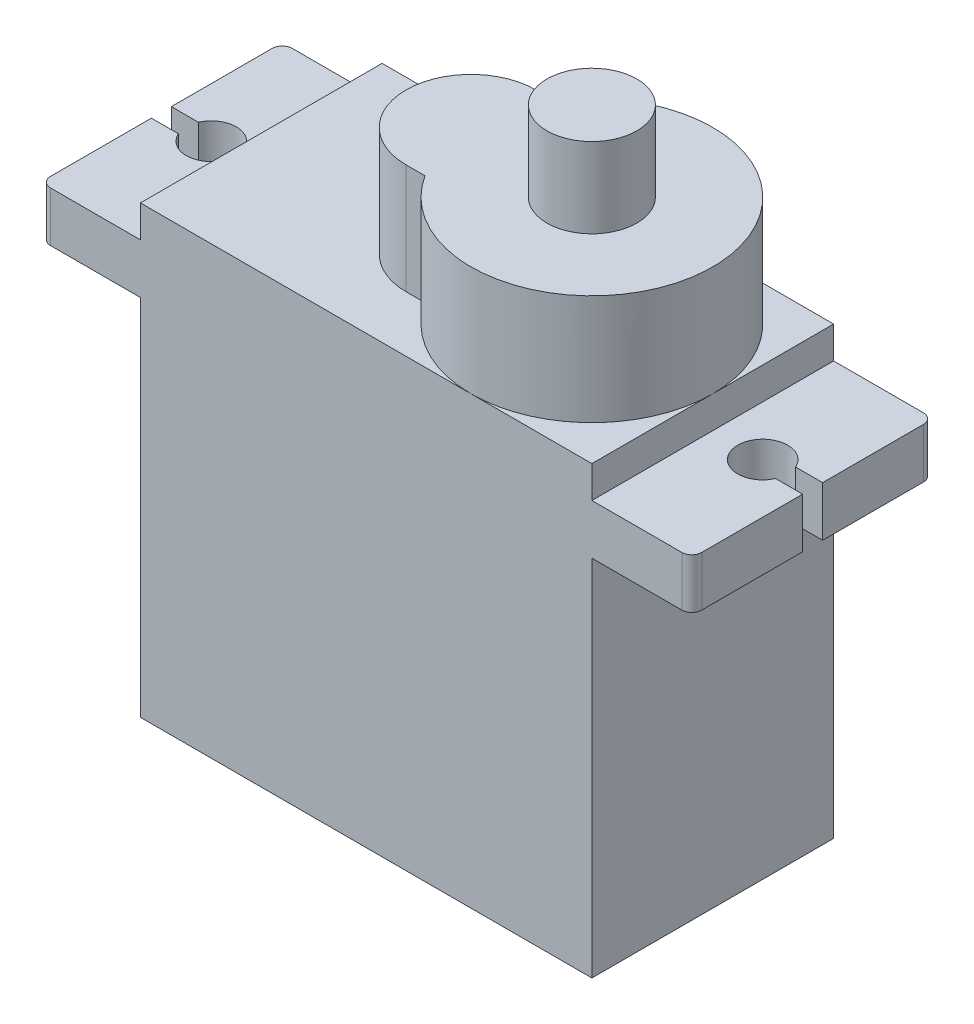
ISO-10303-21;
HEADER;
FILE_DESCRIPTION(('STEP AP214'),'2;1');
FILE_NAME('part.step','',(''),(''),'','','');
FILE_SCHEMA(('AUTOMOTIVE_DESIGN { 1 0 10303 214 1 1 1 1 }'));
ENDSEC;
DATA;
#1=APPLICATION_CONTEXT('core data for automotive mechanical design processes');
#2=APPLICATION_PROTOCOL_DEFINITION('international standard','automotive_design',2000,#1);
#3=PRODUCT_CONTEXT('',#1,'mechanical');
#4=PRODUCT('Part','Part','',(#3));
#5=PRODUCT_RELATED_PRODUCT_CATEGORY('part','',(#4));
#6=PRODUCT_DEFINITION_FORMATION('','',#4);
#7=PRODUCT_DEFINITION_CONTEXT('part definition',#1,'design');
#8=PRODUCT_DEFINITION('design','',#6,#7);
#9=PRODUCT_DEFINITION_SHAPE('','',#8);
#10=(LENGTH_UNIT() NAMED_UNIT(*) SI_UNIT(.MILLI.,.METRE.));
#11=(NAMED_UNIT(*) PLANE_ANGLE_UNIT() SI_UNIT($,.RADIAN.));
#12=(NAMED_UNIT(*) SI_UNIT($,.STERADIAN.) SOLID_ANGLE_UNIT());
#13=UNCERTAINTY_MEASURE_WITH_UNIT(LENGTH_MEASURE(1.E-05),#10,'distance_accuracy_value','');
#14=(GEOMETRIC_REPRESENTATION_CONTEXT(3) GLOBAL_UNCERTAINTY_ASSIGNED_CONTEXT((#13)) GLOBAL_UNIT_ASSIGNED_CONTEXT((#10,
#11,#12)) REPRESENTATION_CONTEXT('',''));
#15=CARTESIAN_POINT('',(0.,0.,0.));
#16=DIRECTION('',(0.,0.,1.));
#17=DIRECTION('',(1.,0.,0.));
#18=AXIS2_PLACEMENT_3D('',#15,#16,#17);
#19=CARTESIAN_POINT('',(-16.3,18.2,6.05));
#20=DIRECTION('',(0.,-1.,0.));
#21=DIRECTION('',(0.,0.,-1.));
#22=AXIS2_PLACEMENT_3D('',#19,#20,#21);
#23=PLANE('',#22);
#24=DIRECTION('',(1.,0.,0.));
#25=VECTOR('',#24,1.);
#26=CARTESIAN_POINT('',(-16.3,18.2,6.05));
#27=LINE('',#26,#25);
#28=CARTESIAN_POINT('',(-15.8,18.2,6.05));
#29=VERTEX_POINT('',#28);
#30=CARTESIAN_POINT('',(-11.3,18.2,6.05));
#31=VERTEX_POINT('',#30);
#32=EDGE_CURVE('E304',#29,#31,#27,.T.);
#33=ORIENTED_EDGE('',*,*,#32,.F.);
#34=CARTESIAN_POINT('',(-15.8,18.2,5.55));
#35=DIRECTION('',(0.,-1.,0.));
#36=DIRECTION('',(0.,0.,-1.));
#37=AXIS2_PLACEMENT_3D('',#34,#35,#36);
#38=CIRCLE('',#37,0.5);
#39=CARTESIAN_POINT('',(-16.3,18.2,5.55));
#40=VERTEX_POINT('',#39);
#41=EDGE_CURVE('E404',#29,#40,#38,.T.);
#42=ORIENTED_EDGE('',*,*,#41,.T.);
#43=DIRECTION('',(0.,0.,-1.));
#44=VECTOR('',#43,1.);
#45=CARTESIAN_POINT('',(-16.3,18.2,6.05));
#46=LINE('',#45,#44);
#47=CARTESIAN_POINT('',(-16.3,18.2,0.5));
#48=VERTEX_POINT('',#47);
#49=EDGE_CURVE('E279',#40,#48,#46,.T.);
#50=ORIENTED_EDGE('',*,*,#49,.T.);
#51=DIRECTION('',(1.,0.,0.));
#52=VECTOR('',#51,1.);
#53=CARTESIAN_POINT('',(0.,18.2,0.500000000000003));
#54=LINE('',#53,#52);
#55=CARTESIAN_POINT('',(-14.945643923739,18.2,0.5));
#56=VERTEX_POINT('',#55);
#57=EDGE_CURVE('E959',#48,#56,#54,.T.);
#58=ORIENTED_EDGE('',*,*,#57,.T.);
#59=CARTESIAN_POINT('',(-13.8,18.2,0.));
#60=DIRECTION('',(0.,-1.,0.));
#61=DIRECTION('',(0.,0.,-1.));
#62=AXIS2_PLACEMENT_3D('',#59,#60,#61);
#63=CIRCLE('',#62,1.25);
#64=CARTESIAN_POINT('',(-14.945643923739,18.2,-0.499999999999999));
#65=VERTEX_POINT('',#64);
#66=EDGE_CURVE('E272',#65,#56,#63,.T.);
#67=ORIENTED_EDGE('',*,*,#66,.F.);
#68=DIRECTION('',(1.,0.,0.));
#69=VECTOR('',#68,1.);
#70=CARTESIAN_POINT('',(0.,18.2,-0.49999999999999));
#71=LINE('',#70,#69);
#72=CARTESIAN_POINT('',(-16.3,18.2,-0.5));
#73=VERTEX_POINT('',#72);
#74=EDGE_CURVE('E254',#73,#65,#71,.T.);
#75=ORIENTED_EDGE('',*,*,#74,.F.);
#76=CARTESIAN_POINT('',(-16.3,18.2,-5.55));
#77=VERTEX_POINT('',#76);
#78=EDGE_CURVE('E268',#73,#77,#46,.T.);
#79=ORIENTED_EDGE('',*,*,#78,.T.);
#80=CARTESIAN_POINT('',(-15.8,18.2,-5.55));
#81=DIRECTION('',(0.,-1.,0.));
#82=DIRECTION('',(0.,0.,-1.));
#83=AXIS2_PLACEMENT_3D('',#80,#81,#82);
#84=CIRCLE('',#83,0.5);
#85=CARTESIAN_POINT('',(-15.8,18.2,-6.05));
#86=VERTEX_POINT('',#85);
#87=EDGE_CURVE('E401',#77,#86,#84,.T.);
#88=ORIENTED_EDGE('',*,*,#87,.T.);
#89=DIRECTION('',(1.,0.,0.));
#90=VECTOR('',#89,1.);
#91=CARTESIAN_POINT('',(-16.3,18.2,-6.05));
#92=LINE('',#91,#90);
#93=CARTESIAN_POINT('',(-11.3,18.2,-6.05));
#94=VERTEX_POINT('',#93);
#95=EDGE_CURVE('E307',#86,#94,#92,.T.);
#96=ORIENTED_EDGE('',*,*,#95,.T.);
#97=DIRECTION('',(0.,0.,-1.));
#98=VECTOR('',#97,1.);
#99=CARTESIAN_POINT('',(-11.3,18.2,6.05));
#100=LINE('',#99,#98);
#101=EDGE_CURVE('E286',#31,#94,#100,.T.);
#102=ORIENTED_EDGE('',*,*,#101,.F.);
#103=EDGE_LOOP('',(#33,#42,#50,#58,#67,#75,#79,#88,#96,#102));
#104=FACE_BOUND('',#103,.T.);
#105=ADVANCED_FACE('F53',(#104),#23,.T.);
#106=CARTESIAN_POINT('',(-16.3,20.7,6.05));
#107=DIRECTION('',(0.,1.,0.));
#108=DIRECTION('',(0.,0.,1.));
#109=AXIS2_PLACEMENT_3D('',#106,#107,#108);
#110=PLANE('',#109);
#111=DIRECTION('',(0.,0.,1.));
#112=VECTOR('',#111,1.);
#113=CARTESIAN_POINT('',(-16.3,20.7,6.05));
#114=LINE('',#113,#112);
#115=CARTESIAN_POINT('',(-16.3,20.7,0.5));
#116=VERTEX_POINT('',#115);
#117=CARTESIAN_POINT('',(-16.3,20.7,5.55));
#118=VERTEX_POINT('',#117);
#119=EDGE_CURVE('E284',#116,#118,#114,.T.);
#120=ORIENTED_EDGE('',*,*,#119,.T.);
#121=CARTESIAN_POINT('',(-15.8,20.7,5.55));
#122=DIRECTION('',(0.,1.,0.));
#123=DIRECTION('',(0.,0.,1.));
#124=AXIS2_PLACEMENT_3D('',#121,#122,#123);
#125=CIRCLE('',#124,0.5);
#126=CARTESIAN_POINT('',(-15.8,20.7,6.05));
#127=VERTEX_POINT('',#126);
#128=EDGE_CURVE('E413',#118,#127,#125,.T.);
#129=ORIENTED_EDGE('',*,*,#128,.T.);
#130=DIRECTION('',(1.,0.,0.));
#131=VECTOR('',#130,1.);
#132=CARTESIAN_POINT('',(-16.3,20.7,6.05));
#133=LINE('',#132,#131);
#134=CARTESIAN_POINT('',(-11.3,20.7,6.05));
#135=VERTEX_POINT('',#134);
#136=EDGE_CURVE('E301',#127,#135,#133,.T.);
#137=ORIENTED_EDGE('',*,*,#136,.T.);
#138=DIRECTION('',(0.,0.,1.));
#139=VECTOR('',#138,1.);
#140=CARTESIAN_POINT('',(-11.3,20.7,6.05));
#141=LINE('',#140,#139);
#142=CARTESIAN_POINT('',(-11.3,20.7,-6.05));
#143=VERTEX_POINT('',#142);
#144=EDGE_CURVE('E280',#143,#135,#141,.T.);
#145=ORIENTED_EDGE('',*,*,#144,.F.);
#146=DIRECTION('',(1.,0.,0.));
#147=VECTOR('',#146,1.);
#148=CARTESIAN_POINT('',(-16.3,20.7,-6.05));
#149=LINE('',#148,#147);
#150=CARTESIAN_POINT('',(-15.8,20.7,-6.05));
#151=VERTEX_POINT('',#150);
#152=EDGE_CURVE('E295',#151,#143,#149,.T.);
#153=ORIENTED_EDGE('',*,*,#152,.F.);
#154=CARTESIAN_POINT('',(-15.8,20.7,-5.55));
#155=DIRECTION('',(0.,1.,0.));
#156=DIRECTION('',(0.,0.,1.));
#157=AXIS2_PLACEMENT_3D('',#154,#155,#156);
#158=CIRCLE('',#157,0.5);
#159=CARTESIAN_POINT('',(-16.3,20.7,-5.55));
#160=VERTEX_POINT('',#159);
#161=EDGE_CURVE('E410',#151,#160,#158,.T.);
#162=ORIENTED_EDGE('',*,*,#161,.T.);
#163=CARTESIAN_POINT('',(-16.3,20.7,-0.5));
#164=VERTEX_POINT('',#163);
#165=EDGE_CURVE('E292',#160,#164,#114,.T.);
#166=ORIENTED_EDGE('',*,*,#165,.T.);
#167=DIRECTION('',(1.,0.,0.));
#168=VECTOR('',#167,1.);
#169=CARTESIAN_POINT('',(0.,20.7,-0.49999999999999));
#170=LINE('',#169,#168);
#171=CARTESIAN_POINT('',(-14.945643923739,20.7,-0.499999999999999));
#172=VERTEX_POINT('',#171);
#173=EDGE_CURVE('E257',#164,#172,#170,.T.);
#174=ORIENTED_EDGE('',*,*,#173,.T.);
#175=CARTESIAN_POINT('',(-13.8,20.7,0.));
#176=DIRECTION('',(0.,-1.,0.));
#177=DIRECTION('',(0.,0.,1.));
#178=AXIS2_PLACEMENT_3D('',#175,#176,#177);
#179=CIRCLE('',#178,1.25);
#180=CARTESIAN_POINT('',(-14.945643923739,20.7,0.5));
#181=VERTEX_POINT('',#180);
#182=EDGE_CURVE('E263',#172,#181,#179,.T.);
#183=ORIENTED_EDGE('',*,*,#182,.T.);
#184=DIRECTION('',(1.,0.,0.));
#185=VECTOR('',#184,1.);
#186=CARTESIAN_POINT('',(0.,20.7,0.500000000000003));
#187=LINE('',#186,#185);
#188=EDGE_CURVE('E613',#116,#181,#187,.T.);
#189=ORIENTED_EDGE('',*,*,#188,.F.);
#190=EDGE_LOOP('',(#120,#129,#137,#145,#153,#162,#166,#174,#183,#189));
#191=FACE_BOUND('',#190,.T.);
#192=ADVANCED_FACE('F610',(#191),#110,.T.);
#193=CARTESIAN_POINT('',(-16.3,0.,0.));
#194=DIRECTION('',(-1.,0.,0.));
#195=DIRECTION('',(0.,0.,-1.));
#196=AXIS2_PLACEMENT_3D('',#193,#194,#195);
#197=PLANE('',#196);
#198=ORIENTED_EDGE('',*,*,#165,.F.);
#199=DIRECTION('',(0.,1.,0.));
#200=VECTOR('',#199,1.);
#201=CARTESIAN_POINT('',(-16.3,18.2,-5.55));
#202=LINE('',#201,#200);
#203=EDGE_CURVE('E277',#160,#77,#202,.F.);
#204=ORIENTED_EDGE('',*,*,#203,.T.);
#205=ORIENTED_EDGE('',*,*,#78,.F.);
#206=DIRECTION('',(0.,1.,0.));
#207=VECTOR('',#206,1.);
#208=CARTESIAN_POINT('',(-16.3,-0.001000000000001,-0.5));
#209=LINE('',#208,#207);
#210=EDGE_CURVE('E251',#73,#164,#209,.T.);
#211=ORIENTED_EDGE('',*,*,#210,.T.);
#212=EDGE_LOOP('',(#198,#204,#205,#211));
#213=FACE_BOUND('',#212,.T.);
#214=ADVANCED_FACE('F275',(#213),#197,.T.);
#215=CARTESIAN_POINT('',(16.3,0.,0.));
#216=DIRECTION('',(1.,0.,0.));
#217=DIRECTION('',(0.,0.,-1.));
#218=AXIS2_PLACEMENT_3D('',#215,#216,#217);
#219=PLANE('',#218);
#220=DIRECTION('',(0.,0.,1.));
#221=VECTOR('',#220,1.);
#222=CARTESIAN_POINT('',(16.3,20.7,6.05));
#223=LINE('',#222,#221);
#224=CARTESIAN_POINT('',(16.3,20.7,0.5));
#225=VERTEX_POINT('',#224);
#226=CARTESIAN_POINT('',(16.3,20.7,5.55));
#227=VERTEX_POINT('',#226);
#228=EDGE_CURVE('E315',#225,#227,#223,.T.);
#229=ORIENTED_EDGE('',*,*,#228,.T.);
#230=DIRECTION('',(0.,-1.,0.));
#231=VECTOR('',#230,1.);
#232=CARTESIAN_POINT('',(16.3,18.2,5.55));
#233=LINE('',#232,#231);
#234=CARTESIAN_POINT('',(16.3,18.2,5.55));
#235=VERTEX_POINT('',#234);
#236=EDGE_CURVE('E11',#227,#235,#233,.T.);
#237=ORIENTED_EDGE('',*,*,#236,.T.);
#238=DIRECTION('',(0.,0.,-1.));
#239=VECTOR('',#238,1.);
#240=CARTESIAN_POINT('',(16.3,18.2,6.05));
#241=LINE('',#240,#239);
#242=CARTESIAN_POINT('',(16.3,18.2,0.5));
#243=VERTEX_POINT('',#242);
#244=EDGE_CURVE('E316',#235,#243,#241,.T.);
#245=ORIENTED_EDGE('',*,*,#244,.T.);
#246=DIRECTION('',(0.,1.,0.));
#247=VECTOR('',#246,1.);
#248=CARTESIAN_POINT('',(16.3,-0.001000000000001,0.5));
#249=LINE('',#248,#247);
#250=EDGE_CURVE('E509',#243,#225,#249,.T.);
#251=ORIENTED_EDGE('',*,*,#250,.T.);
#252=EDGE_LOOP('',(#229,#237,#245,#251));
#253=FACE_BOUND('',#252,.T.);
#254=ADVANCED_FACE('F472',(#253),#219,.T.);
#255=CARTESIAN_POINT('',(0.,22.3,0.));
#256=DIRECTION('',(0.,-1.,0.));
#257=DIRECTION('',(0.,0.,-1.));
#258=AXIS2_PLACEMENT_3D('',#255,#256,#257);
#259=PLANE('',#258);
#260=CARTESIAN_POINT('',(5.25,22.3,0.));
#261=DIRECTION('',(0.,1.,0.));
#262=DIRECTION('',(0.,0.,1.));
#263=AXIS2_PLACEMENT_3D('',#260,#261,#262);
#264=CIRCLE('',#263,6.05);
#265=CARTESIAN_POINT('',(0.147059671130777,22.3,3.25));
#266=VERTEX_POINT('',#265);
#267=CARTESIAN_POINT('',(5.25,22.3,6.05));
#268=VERTEX_POINT('',#267);
#269=EDGE_CURVE('E523',#266,#268,#264,.T.);
#270=ORIENTED_EDGE('',*,*,#269,.F.);
#271=DIRECTION('',(1.,0.,0.));
#272=VECTOR('',#271,1.);
#273=CARTESIAN_POINT('',(0.,22.3,3.25));
#274=LINE('',#273,#272);
#275=CARTESIAN_POINT('',(-0.799999999999995,22.3,3.25));
#276=VERTEX_POINT('',#275);
#277=EDGE_CURVE('E532',#276,#266,#274,.T.);
#278=ORIENTED_EDGE('',*,*,#277,.F.);
#279=CARTESIAN_POINT('',(-0.799999999999995,22.3,0.));
#280=DIRECTION('',(0.,1.,0.));
#281=DIRECTION('',(0.,0.,1.));
#282=AXIS2_PLACEMENT_3D('',#279,#280,#281);
#283=CIRCLE('',#282,3.25);
#284=CARTESIAN_POINT('',(-0.799999999999996,22.3,-3.25));
#285=VERTEX_POINT('',#284);
#286=EDGE_CURVE('E550',#276,#285,#283,.F.);
#287=ORIENTED_EDGE('',*,*,#286,.T.);
#288=DIRECTION('',(1.,0.,0.));
#289=VECTOR('',#288,1.);
#290=CARTESIAN_POINT('',(0.,22.3,-3.25));
#291=LINE('',#290,#289);
#292=CARTESIAN_POINT('',(0.147059671130776,22.3,-3.25));
#293=VERTEX_POINT('',#292);
#294=EDGE_CURVE('E546',#285,#293,#291,.T.);
#295=ORIENTED_EDGE('',*,*,#294,.T.);
#296=CARTESIAN_POINT('',(5.25,22.3,-6.05));
#297=VERTEX_POINT('',#296);
#298=EDGE_CURVE('E392',#297,#293,#264,.T.);
#299=ORIENTED_EDGE('',*,*,#298,.F.);
#300=DIRECTION('',(-1.,0.,0.));
#301=VECTOR('',#300,1.);
#302=CARTESIAN_POINT('',(-11.3,22.3,-6.05));
#303=LINE('',#302,#301);
#304=CARTESIAN_POINT('',(-11.3,22.3,-6.05));
#305=VERTEX_POINT('',#304);
#306=EDGE_CURVE('E343',#297,#305,#303,.T.);
#307=ORIENTED_EDGE('',*,*,#306,.T.);
#308=DIRECTION('',(0.,0.,1.));
#309=VECTOR('',#308,1.);
#310=CARTESIAN_POINT('',(-11.3,22.3,6.05));
#311=LINE('',#310,#309);
#312=CARTESIAN_POINT('',(-11.3,22.3,6.05));
#313=VERTEX_POINT('',#312);
#314=EDGE_CURVE('E349',#305,#313,#311,.T.);
#315=ORIENTED_EDGE('',*,*,#314,.T.);
#316=DIRECTION('',(1.,0.,0.));
#317=VECTOR('',#316,1.);
#318=CARTESIAN_POINT('',(-11.3,22.3,6.05));
#319=LINE('',#318,#317);
#320=EDGE_CURVE('E353',#313,#268,#319,.T.);
#321=ORIENTED_EDGE('',*,*,#320,.T.);
#322=EDGE_LOOP('',(#270,#278,#287,#295,#299,#307,#315,#321));
#323=FACE_BOUND('',#322,.T.);
#324=ADVANCED_FACE('F581',(#323),#259,.F.);
#325=CARTESIAN_POINT('',(11.3,22.3,0.));
#326=VERTEX_POINT('',#325);
#327=EDGE_CURVE('E527',#268,#326,#264,.T.);
#328=ORIENTED_EDGE('',*,*,#327,.F.);
#329=CARTESIAN_POINT('',(11.3,22.3,6.05));
#330=VERTEX_POINT('',#329);
#331=EDGE_CURVE('E352',#268,#330,#319,.T.);
#332=ORIENTED_EDGE('',*,*,#331,.T.);
#333=DIRECTION('',(0.,0.,-1.));
#334=VECTOR('',#333,1.);
#335=CARTESIAN_POINT('',(11.3,22.3,6.05));
#336=LINE('',#335,#334);
#337=EDGE_CURVE('E339',#330,#326,#336,.T.);
#338=ORIENTED_EDGE('',*,*,#337,.T.);
#339=EDGE_LOOP('',(#328,#332,#338));
#340=FACE_BOUND('',#339,.T.);
#341=ADVANCED_FACE('F646',(#340),#259,.F.);
#342=EDGE_CURVE('E577',#326,#297,#264,.T.);
#343=ORIENTED_EDGE('',*,*,#342,.F.);
#344=CARTESIAN_POINT('',(11.3,22.3,-6.05));
#345=VERTEX_POINT('',#344);
#346=EDGE_CURVE('E344',#326,#345,#336,.T.);
#347=ORIENTED_EDGE('',*,*,#346,.T.);
#348=EDGE_CURVE('E345',#345,#297,#303,.T.);
#349=ORIENTED_EDGE('',*,*,#348,.T.);
#350=EDGE_LOOP('',(#343,#347,#349));
#351=FACE_BOUND('',#350,.T.);
#352=ADVANCED_FACE('F643',(#351),#259,.F.);
#353=CARTESIAN_POINT('',(-11.3,22.3,6.05));
#354=DIRECTION('',(1.,0.,0.));
#355=DIRECTION('',(0.,0.,-1.));
#356=AXIS2_PLACEMENT_3D('',#353,#354,#355);
#357=PLANE('',#356);
#358=DIRECTION('',(0.,-1.,0.));
#359=VECTOR('',#358,1.);
#360=CARTESIAN_POINT('',(-11.3,22.3,-6.05));
#361=LINE('',#360,#359);
#362=EDGE_CURVE('E383',#305,#143,#361,.T.);
#363=ORIENTED_EDGE('',*,*,#362,.T.);
#364=ORIENTED_EDGE('',*,*,#144,.T.);
#365=DIRECTION('',(0.,-1.,0.));
#366=VECTOR('',#365,1.);
#367=CARTESIAN_POINT('',(-11.3,22.3,6.05));
#368=LINE('',#367,#366);
#369=EDGE_CURVE('E378',#313,#135,#368,.T.);
#370=ORIENTED_EDGE('',*,*,#369,.F.);
#371=ORIENTED_EDGE('',*,*,#314,.F.);
#372=EDGE_LOOP('',(#363,#364,#370,#371));
#373=FACE_BOUND('',#372,.T.);
#374=ADVANCED_FACE('F645',(#373),#357,.F.);
#375=CARTESIAN_POINT('',(11.3,22.3,6.05));
#376=DIRECTION('',(-1.,0.,0.));
#377=DIRECTION('',(0.,0.,1.));
#378=AXIS2_PLACEMENT_3D('',#375,#376,#377);
#379=PLANE('',#378);
#380=DIRECTION('',(0.,0.,-1.));
#381=VECTOR('',#380,1.);
#382=CARTESIAN_POINT('',(11.3,18.2,6.05));
#383=LINE('',#382,#381);
#384=CARTESIAN_POINT('',(11.3,18.2,6.05));
#385=VERTEX_POINT('',#384);
#386=CARTESIAN_POINT('',(11.3,18.2,-6.05));
#387=VERTEX_POINT('',#386);
#388=EDGE_CURVE('E323',#385,#387,#383,.T.);
#389=ORIENTED_EDGE('',*,*,#388,.F.);
#390=DIRECTION('',(0.,-1.,0.));
#391=VECTOR('',#390,1.);
#392=CARTESIAN_POINT('',(11.3,22.3,6.05));
#393=LINE('',#392,#391);
#394=CARTESIAN_POINT('',(11.3,0.,6.05));
#395=VERTEX_POINT('',#394);
#396=EDGE_CURVE('E357',#385,#395,#393,.T.);
#397=ORIENTED_EDGE('',*,*,#396,.T.);
#398=DIRECTION('',(0.,0.,-1.));
#399=VECTOR('',#398,1.);
#400=CARTESIAN_POINT('',(11.3,0.,6.05));
#401=LINE('',#400,#399);
#402=CARTESIAN_POINT('',(11.3,0.,-6.05));
#403=VERTEX_POINT('',#402);
#404=EDGE_CURVE('E338',#395,#403,#401,.T.);
#405=ORIENTED_EDGE('',*,*,#404,.T.);
#406=DIRECTION('',(0.,-1.,0.));
#407=VECTOR('',#406,1.);
#408=CARTESIAN_POINT('',(11.3,22.3,-6.05));
#409=LINE('',#408,#407);
#410=EDGE_CURVE('E387',#387,#403,#409,.T.);
#411=ORIENTED_EDGE('',*,*,#410,.F.);
#412=EDGE_LOOP('',(#389,#397,#405,#411));
#413=FACE_BOUND('',#412,.T.);
#414=ADVANCED_FACE('F633',(#413),#379,.F.);
#415=DIRECTION('',(0.,0.,1.));
#416=VECTOR('',#415,1.);
#417=CARTESIAN_POINT('',(11.3,20.7,6.05));
#418=LINE('',#417,#416);
#419=CARTESIAN_POINT('',(11.3,20.7,-6.05));
#420=VERTEX_POINT('',#419);
#421=CARTESIAN_POINT('',(11.3,20.7,6.05));
#422=VERTEX_POINT('',#421);
#423=EDGE_CURVE('E310',#420,#422,#418,.T.);
#424=ORIENTED_EDGE('',*,*,#423,.F.);
#425=EDGE_CURVE('E388',#345,#420,#409,.T.);
#426=ORIENTED_EDGE('',*,*,#425,.F.);
#427=ORIENTED_EDGE('',*,*,#346,.F.);
#428=ORIENTED_EDGE('',*,*,#337,.F.);
#429=EDGE_CURVE('E373',#330,#422,#393,.T.);
#430=ORIENTED_EDGE('',*,*,#429,.T.);
#431=EDGE_LOOP('',(#424,#426,#427,#428,#430));
#432=FACE_BOUND('',#431,.T.);
#433=ADVANCED_FACE('F466',(#432),#379,.F.);
#434=CARTESIAN_POINT('',(-11.3,22.3,-6.05));
#435=DIRECTION('',(0.,0.,1.));
#436=DIRECTION('',(1.,0.,0.));
#437=AXIS2_PLACEMENT_3D('',#434,#435,#436);
#438=PLANE('',#437);
#439=ORIENTED_EDGE('',*,*,#95,.F.);
#440=DIRECTION('',(0.,1.,0.));
#441=VECTOR('',#440,1.);
#442=CARTESIAN_POINT('',(-15.8,20.7,-6.05));
#443=LINE('',#442,#441);
#444=EDGE_CURVE('E419',#86,#151,#443,.T.);
#445=ORIENTED_EDGE('',*,*,#444,.T.);
#446=ORIENTED_EDGE('',*,*,#152,.T.);
#447=ORIENTED_EDGE('',*,*,#362,.F.);
#448=ORIENTED_EDGE('',*,*,#306,.F.);
#449=ORIENTED_EDGE('',*,*,#348,.F.);
#450=ORIENTED_EDGE('',*,*,#425,.T.);
#451=DIRECTION('',(-1.,0.,0.));
#452=VECTOR('',#451,1.);
#453=CARTESIAN_POINT('',(16.3,20.7,-6.05));
#454=LINE('',#453,#452);
#455=CARTESIAN_POINT('',(15.8,20.7,-6.05));
#456=VERTEX_POINT('',#455);
#457=EDGE_CURVE('E335',#456,#420,#454,.T.);
#458=ORIENTED_EDGE('',*,*,#457,.F.);
#459=DIRECTION('',(0.,1.,0.));
#460=VECTOR('',#459,1.);
#461=CARTESIAN_POINT('',(15.8,18.2,-6.05));
#462=LINE('',#461,#460);
#463=CARTESIAN_POINT('',(15.8,18.2,-6.05));
#464=VERTEX_POINT('',#463);
#465=EDGE_CURVE('E416',#456,#464,#462,.F.);
#466=ORIENTED_EDGE('',*,*,#465,.T.);
#467=DIRECTION('',(-1.,0.,0.));
#468=VECTOR('',#467,1.);
#469=CARTESIAN_POINT('',(16.3,18.2,-6.05));
#470=LINE('',#469,#468);
#471=EDGE_CURVE('E319',#464,#387,#470,.T.);
#472=ORIENTED_EDGE('',*,*,#471,.T.);
#473=ORIENTED_EDGE('',*,*,#410,.T.);
#474=DIRECTION('',(-1.,0.,0.));
#475=VECTOR('',#474,1.);
#476=CARTESIAN_POINT('',(-11.3,0.,-6.05));
#477=LINE('',#476,#475);
#478=CARTESIAN_POINT('',(-11.3,0.,-6.05));
#479=VERTEX_POINT('',#478);
#480=EDGE_CURVE('E361',#403,#479,#477,.T.);
#481=ORIENTED_EDGE('',*,*,#480,.T.);
#482=EDGE_CURVE('E382',#94,#479,#361,.T.);
#483=ORIENTED_EDGE('',*,*,#482,.F.);
#484=EDGE_LOOP('',(#439,#445,#446,#447,#448,#449,#450,#458,#466,#472,#473,#481,#483));
#485=FACE_BOUND('',#484,.T.);
#486=ADVANCED_FACE('F460',(#485),#438,.F.);
#487=CARTESIAN_POINT('',(-11.3,0.,6.05));
#488=VERTEX_POINT('',#487);
#489=EDGE_CURVE('E377',#31,#488,#368,.T.);
#490=ORIENTED_EDGE('',*,*,#489,.F.);
#491=ORIENTED_EDGE('',*,*,#101,.T.);
#492=ORIENTED_EDGE('',*,*,#482,.T.);
#493=DIRECTION('',(0.,0.,1.));
#494=VECTOR('',#493,1.);
#495=CARTESIAN_POINT('',(-11.3,0.,6.05));
#496=LINE('',#495,#494);
#497=EDGE_CURVE('E365',#479,#488,#496,.T.);
#498=ORIENTED_EDGE('',*,*,#497,.T.);
#499=EDGE_LOOP('',(#490,#491,#492,#498));
#500=FACE_BOUND('',#499,.T.);
#501=ADVANCED_FACE('F625',(#500),#357,.F.);
#502=CARTESIAN_POINT('',(-11.3,22.3,6.05));
#503=DIRECTION('',(0.,0.,-1.));
#504=DIRECTION('',(-1.,0.,0.));
#505=AXIS2_PLACEMENT_3D('',#502,#503,#504);
#506=PLANE('',#505);
#507=ORIENTED_EDGE('',*,*,#136,.F.);
#508=DIRECTION('',(0.,-1.,0.));
#509=VECTOR('',#508,1.);
#510=CARTESIAN_POINT('',(-15.8,18.2,6.05));
#511=LINE('',#510,#509);
#512=EDGE_CURVE('E396',#127,#29,#511,.T.);
#513=ORIENTED_EDGE('',*,*,#512,.T.);
#514=ORIENTED_EDGE('',*,*,#32,.T.);
#515=ORIENTED_EDGE('',*,*,#489,.T.);
#516=DIRECTION('',(1.,0.,0.));
#517=VECTOR('',#516,1.);
#518=CARTESIAN_POINT('',(-11.3,0.,6.05));
#519=LINE('',#518,#517);
#520=EDGE_CURVE('E369',#488,#395,#519,.T.);
#521=ORIENTED_EDGE('',*,*,#520,.T.);
#522=ORIENTED_EDGE('',*,*,#396,.F.);
#523=DIRECTION('',(-1.,0.,0.));
#524=VECTOR('',#523,1.);
#525=CARTESIAN_POINT('',(16.3,18.2,6.05));
#526=LINE('',#525,#524);
#527=CARTESIAN_POINT('',(15.8,18.2,6.05));
#528=VERTEX_POINT('',#527);
#529=EDGE_CURVE('E329',#528,#385,#526,.T.);
#530=ORIENTED_EDGE('',*,*,#529,.F.);
#531=DIRECTION('',(0.,-1.,0.));
#532=VECTOR('',#531,1.);
#533=CARTESIAN_POINT('',(15.8,20.7,6.05));
#534=LINE('',#533,#532);
#535=CARTESIAN_POINT('',(15.8,20.7,6.05));
#536=VERTEX_POINT('',#535);
#537=EDGE_CURVE('E393',#528,#536,#534,.F.);
#538=ORIENTED_EDGE('',*,*,#537,.T.);
#539=DIRECTION('',(-1.,0.,0.));
#540=VECTOR('',#539,1.);
#541=CARTESIAN_POINT('',(16.3,20.7,6.05));
#542=LINE('',#541,#540);
#543=EDGE_CURVE('E332',#536,#422,#542,.T.);
#544=ORIENTED_EDGE('',*,*,#543,.T.);
#545=ORIENTED_EDGE('',*,*,#429,.F.);
#546=ORIENTED_EDGE('',*,*,#331,.F.);
#547=ORIENTED_EDGE('',*,*,#320,.F.);
#548=ORIENTED_EDGE('',*,*,#369,.T.);
#549=EDGE_LOOP('',(#507,#513,#514,#515,#521,#522,#530,#538,#544,#545,#546,#547,#548));
#550=FACE_BOUND('',#549,.T.);
#551=ADVANCED_FACE('F597',(#550),#506,.F.);
#552=CARTESIAN_POINT('',(0.,0.,0.));
#553=DIRECTION('',(0.,-1.,0.));
#554=DIRECTION('',(0.,0.,-1.));
#555=AXIS2_PLACEMENT_3D('',#552,#553,#554);
#556=PLANE('',#555);
#557=ORIENTED_EDGE('',*,*,#404,.F.);
#558=ORIENTED_EDGE('',*,*,#520,.F.);
#559=ORIENTED_EDGE('',*,*,#497,.F.);
#560=ORIENTED_EDGE('',*,*,#480,.F.);
#561=EDGE_LOOP('',(#557,#558,#559,#560));
#562=FACE_BOUND('',#561,.T.);
#563=ADVANCED_FACE('F638',(#562),#556,.T.);
#564=CARTESIAN_POINT('',(16.3,20.7,6.05));
#565=DIRECTION('',(0.,-1.,0.));
#566=DIRECTION('',(0.,0.,-1.));
#567=AXIS2_PLACEMENT_3D('',#564,#565,#566);
#568=PLANE('',#567);
#569=CARTESIAN_POINT('',(16.3,20.7,-5.55));
#570=VERTEX_POINT('',#569);
#571=CARTESIAN_POINT('',(16.3,20.7,-0.5));
#572=VERTEX_POINT('',#571);
#573=EDGE_CURVE('E311',#570,#572,#223,.T.);
#574=ORIENTED_EDGE('',*,*,#573,.F.);
#575=CARTESIAN_POINT('',(15.8,20.7,-5.55));
#576=DIRECTION('',(0.,-1.,0.));
#577=DIRECTION('',(0.,0.,-1.));
#578=AXIS2_PLACEMENT_3D('',#575,#576,#577);
#579=CIRCLE('',#578,0.5);
#580=EDGE_CURVE('E431',#570,#456,#579,.F.);
#581=ORIENTED_EDGE('',*,*,#580,.T.);
#582=ORIENTED_EDGE('',*,*,#457,.T.);
#583=ORIENTED_EDGE('',*,*,#423,.T.);
#584=ORIENTED_EDGE('',*,*,#543,.F.);
#585=CARTESIAN_POINT('',(15.8,20.7,5.55));
#586=DIRECTION('',(0.,-1.,0.));
#587=DIRECTION('',(0.,0.,-1.));
#588=AXIS2_PLACEMENT_3D('',#585,#586,#587);
#589=CIRCLE('',#588,0.5);
#590=EDGE_CURVE('E76',#536,#227,#589,.F.);
#591=ORIENTED_EDGE('',*,*,#590,.T.);
#592=ORIENTED_EDGE('',*,*,#228,.F.);
#593=DIRECTION('',(-1.,0.,0.));
#594=VECTOR('',#593,1.);
#595=CARTESIAN_POINT('',(0.,20.7,0.500000000000003));
#596=LINE('',#595,#594);
#597=CARTESIAN_POINT('',(14.945643923739,20.7,0.5));
#598=VERTEX_POINT('',#597);
#599=EDGE_CURVE('E502',#225,#598,#596,.T.);
#600=ORIENTED_EDGE('',*,*,#599,.T.);
#601=CARTESIAN_POINT('',(13.8,20.7,0.));
#602=DIRECTION('',(0.,1.,0.));
#603=DIRECTION('',(0.,0.,1.));
#604=AXIS2_PLACEMENT_3D('',#601,#602,#603);
#605=CIRCLE('',#604,1.25);
#606=CARTESIAN_POINT('',(14.945643923739,20.7,-0.499999999999999));
#607=VERTEX_POINT('',#606);
#608=EDGE_CURVE('E498',#607,#598,#605,.T.);
#609=ORIENTED_EDGE('',*,*,#608,.F.);
#610=DIRECTION('',(-1.,0.,0.));
#611=VECTOR('',#610,1.);
#612=CARTESIAN_POINT('',(0.,20.7,-0.49999999999999));
#613=LINE('',#612,#611);
#614=EDGE_CURVE('E489',#572,#607,#613,.T.);
#615=ORIENTED_EDGE('',*,*,#614,.F.);
#616=EDGE_LOOP('',(#574,#581,#582,#583,#584,#591,#592,#600,#609,#615));
#617=FACE_BOUND('',#616,.T.);
#618=ADVANCED_FACE('F455',(#617),#568,.F.);
#619=CARTESIAN_POINT('',(16.3,18.2,6.05));
#620=DIRECTION('',(0.,1.,0.));
#621=DIRECTION('',(0.,0.,1.));
#622=AXIS2_PLACEMENT_3D('',#619,#620,#621);
#623=PLANE('',#622);
#624=ORIENTED_EDGE('',*,*,#471,.F.);
#625=CARTESIAN_POINT('',(15.8,18.2,-5.55));
#626=DIRECTION('',(0.,1.,0.));
#627=DIRECTION('',(0.,0.,1.));
#628=AXIS2_PLACEMENT_3D('',#625,#626,#627);
#629=CIRCLE('',#628,0.5);
#630=CARTESIAN_POINT('',(16.3,18.2,-5.55));
#631=VERTEX_POINT('',#630);
#632=EDGE_CURVE('E62',#464,#631,#629,.F.);
#633=ORIENTED_EDGE('',*,*,#632,.T.);
#634=CARTESIAN_POINT('',(16.3,18.2,-0.5));
#635=VERTEX_POINT('',#634);
#636=EDGE_CURVE('E314',#635,#631,#241,.T.);
#637=ORIENTED_EDGE('',*,*,#636,.F.);
#638=DIRECTION('',(1.,0.,0.));
#639=VECTOR('',#638,1.);
#640=CARTESIAN_POINT('',(0.,18.2,-0.49999999999999));
#641=LINE('',#640,#639);
#642=CARTESIAN_POINT('',(14.945643923739,18.2,-0.499999999999999));
#643=VERTEX_POINT('',#642);
#644=EDGE_CURVE('E484',#643,#635,#641,.T.);
#645=ORIENTED_EDGE('',*,*,#644,.F.);
#646=CARTESIAN_POINT('',(13.8,18.2,0.));
#647=DIRECTION('',(0.,1.,0.));
#648=DIRECTION('',(0.,0.,1.));
#649=AXIS2_PLACEMENT_3D('',#646,#647,#648);
#650=CIRCLE('',#649,1.25);
#651=CARTESIAN_POINT('',(14.945643923739,18.2,0.5));
#652=VERTEX_POINT('',#651);
#653=EDGE_CURVE('E481',#652,#643,#650,.F.);
#654=ORIENTED_EDGE('',*,*,#653,.F.);
#655=DIRECTION('',(1.,0.,0.));
#656=VECTOR('',#655,1.);
#657=CARTESIAN_POINT('',(0.,18.2,0.500000000000003));
#658=LINE('',#657,#656);
#659=EDGE_CURVE('E479',#652,#243,#658,.T.);
#660=ORIENTED_EDGE('',*,*,#659,.T.);
#661=ORIENTED_EDGE('',*,*,#244,.F.);
#662=CARTESIAN_POINT('',(15.8,18.2,5.55));
#663=DIRECTION('',(0.,1.,0.));
#664=DIRECTION('',(0.,0.,1.));
#665=AXIS2_PLACEMENT_3D('',#662,#663,#664);
#666=CIRCLE('',#665,0.5);
#667=EDGE_CURVE('E69',#235,#528,#666,.F.);
#668=ORIENTED_EDGE('',*,*,#667,.T.);
#669=ORIENTED_EDGE('',*,*,#529,.T.);
#670=ORIENTED_EDGE('',*,*,#388,.T.);
#671=EDGE_LOOP('',(#624,#633,#637,#645,#654,#660,#661,#668,#669,#670));
#672=FACE_BOUND('',#671,.T.);
#673=ADVANCED_FACE('F441',(#672),#623,.F.);
#674=ORIENTED_EDGE('',*,*,#636,.T.);
#675=DIRECTION('',(0.,1.,0.));
#676=VECTOR('',#675,1.);
#677=CARTESIAN_POINT('',(16.3,20.7,-5.55));
#678=LINE('',#677,#676);
#679=EDGE_CURVE('E425',#631,#570,#678,.T.);
#680=ORIENTED_EDGE('',*,*,#679,.T.);
#681=ORIENTED_EDGE('',*,*,#573,.T.);
#682=DIRECTION('',(0.,1.,0.));
#683=VECTOR('',#682,1.);
#684=CARTESIAN_POINT('',(16.3,-0.001000000000001,-0.5));
#685=LINE('',#684,#683);
#686=EDGE_CURVE('E451',#635,#572,#685,.T.);
#687=ORIENTED_EDGE('',*,*,#686,.F.);
#688=EDGE_LOOP('',(#674,#680,#681,#687));
#689=FACE_BOUND('',#688,.T.);
#690=ADVANCED_FACE('F448',(#689),#219,.T.);
#691=ORIENTED_EDGE('',*,*,#49,.F.);
#692=DIRECTION('',(0.,-1.,0.));
#693=VECTOR('',#692,1.);
#694=CARTESIAN_POINT('',(-16.3,20.7,5.55));
#695=LINE('',#694,#693);
#696=EDGE_CURVE('E407',#40,#118,#695,.F.);
#697=ORIENTED_EDGE('',*,*,#696,.T.);
#698=ORIENTED_EDGE('',*,*,#119,.F.);
#699=DIRECTION('',(0.,1.,0.));
#700=VECTOR('',#699,1.);
#701=CARTESIAN_POINT('',(-16.3,-0.001000000000001,0.5));
#702=LINE('',#701,#700);
#703=EDGE_CURVE('E262',#48,#116,#702,.T.);
#704=ORIENTED_EDGE('',*,*,#703,.F.);
#705=EDGE_LOOP('',(#691,#697,#698,#704));
#706=FACE_BOUND('',#705,.T.);
#707=ADVANCED_FACE('F669',(#706),#197,.T.);
#708=CARTESIAN_POINT('',(5.25,27.8,0.));
#709=DIRECTION('',(0.,-1.,0.));
#710=DIRECTION('',(0.,0.,-1.));
#711=AXIS2_PLACEMENT_3D('',#708,#709,#710);
#712=CYLINDRICAL_SURFACE('',#711,6.05);
#713=ORIENTED_EDGE('',*,*,#269,.T.);
#714=ORIENTED_EDGE('',*,*,#327,.T.);
#715=ORIENTED_EDGE('',*,*,#342,.T.);
#716=ORIENTED_EDGE('',*,*,#298,.T.);
#717=DIRECTION('',(0.,-1.,0.));
#718=VECTOR('',#717,1.);
#719=CARTESIAN_POINT('',(0.147059671130776,27.8,-3.25));
#720=LINE('',#719,#718);
#721=CARTESIAN_POINT('',(0.147059671130776,27.8,-3.25));
#722=VERTEX_POINT('',#721);
#723=EDGE_CURVE('E290',#722,#293,#720,.T.);
#724=ORIENTED_EDGE('',*,*,#723,.F.);
#725=CARTESIAN_POINT('',(5.25,27.8,0.));
#726=DIRECTION('',(0.,1.,0.));
#727=DIRECTION('',(0.,0.,1.));
#728=AXIS2_PLACEMENT_3D('',#725,#726,#727);
#729=CIRCLE('',#728,6.05);
#730=CARTESIAN_POINT('',(0.147059671130777,27.8,3.25));
#731=VERTEX_POINT('',#730);
#732=EDGE_CURVE('E528',#731,#722,#729,.T.);
#733=ORIENTED_EDGE('',*,*,#732,.F.);
#734=DIRECTION('',(0.,-1.,0.));
#735=VECTOR('',#734,1.);
#736=CARTESIAN_POINT('',(0.147059671130777,27.8,3.25));
#737=LINE('',#736,#735);
#738=EDGE_CURVE('E543',#731,#266,#737,.T.);
#739=ORIENTED_EDGE('',*,*,#738,.T.);
#740=EDGE_LOOP('',(#713,#714,#715,#716,#724,#733,#739));
#741=FACE_BOUND('',#740,.T.);
#742=ADVANCED_FACE('F575',(#741),#712,.T.);
#743=CARTESIAN_POINT('',(0.,27.8,-3.25));
#744=DIRECTION('',(0.,0.,-1.));
#745=DIRECTION('',(-1.,0.,0.));
#746=AXIS2_PLACEMENT_3D('',#743,#744,#745);
#747=PLANE('',#746);
#748=ORIENTED_EDGE('',*,*,#294,.F.);
#749=DIRECTION('',(0.,-1.,0.));
#750=VECTOR('',#749,1.);
#751=CARTESIAN_POINT('',(-0.799999999999996,27.8,-3.25));
#752=LINE('',#751,#750);
#753=CARTESIAN_POINT('',(-0.799999999999996,27.8,-3.25));
#754=VERTEX_POINT('',#753);
#755=EDGE_CURVE('E561',#754,#285,#752,.T.);
#756=ORIENTED_EDGE('',*,*,#755,.F.);
#757=DIRECTION('',(1.,0.,0.));
#758=VECTOR('',#757,1.);
#759=CARTESIAN_POINT('',(0.,27.8,-3.25));
#760=LINE('',#759,#758);
#761=EDGE_CURVE('E531',#754,#722,#760,.T.);
#762=ORIENTED_EDGE('',*,*,#761,.T.);
#763=ORIENTED_EDGE('',*,*,#723,.T.);
#764=EDGE_LOOP('',(#748,#756,#762,#763));
#765=FACE_BOUND('',#764,.T.);
#766=ADVANCED_FACE('F570',(#765),#747,.T.);
#767=CARTESIAN_POINT('',(-0.799999999999995,27.8,0.));
#768=DIRECTION('',(0.,-1.,0.));
#769=DIRECTION('',(0.,0.,-1.));
#770=AXIS2_PLACEMENT_3D('',#767,#768,#769);
#771=CYLINDRICAL_SURFACE('',#770,3.25);
#772=ORIENTED_EDGE('',*,*,#286,.F.);
#773=DIRECTION('',(0.,-1.,0.));
#774=VECTOR('',#773,1.);
#775=CARTESIAN_POINT('',(-0.799999999999995,27.8,3.25));
#776=LINE('',#775,#774);
#777=CARTESIAN_POINT('',(-0.799999999999995,27.8,3.25));
#778=VERTEX_POINT('',#777);
#779=EDGE_CURVE('E559',#778,#276,#776,.T.);
#780=ORIENTED_EDGE('',*,*,#779,.F.);
#781=CARTESIAN_POINT('',(-0.799999999999995,27.8,0.));
#782=DIRECTION('',(0.,1.,0.));
#783=DIRECTION('',(0.,0.,1.));
#784=AXIS2_PLACEMENT_3D('',#781,#782,#783);
#785=CIRCLE('',#784,3.25);
#786=EDGE_CURVE('E536',#778,#754,#785,.F.);
#787=ORIENTED_EDGE('',*,*,#786,.T.);
#788=ORIENTED_EDGE('',*,*,#755,.T.);
#789=EDGE_LOOP('',(#772,#780,#787,#788));
#790=FACE_BOUND('',#789,.T.);
#791=ADVANCED_FACE('F583',(#790),#771,.T.);
#792=CARTESIAN_POINT('',(0.,27.8,3.25));
#793=DIRECTION('',(0.,0.,-1.));
#794=DIRECTION('',(-1.,0.,0.));
#795=AXIS2_PLACEMENT_3D('',#792,#793,#794);
#796=PLANE('',#795);
#797=ORIENTED_EDGE('',*,*,#277,.T.);
#798=ORIENTED_EDGE('',*,*,#738,.F.);
#799=DIRECTION('',(1.,0.,0.));
#800=VECTOR('',#799,1.);
#801=CARTESIAN_POINT('',(0.,27.8,3.25));
#802=LINE('',#801,#800);
#803=EDGE_CURVE('E540',#778,#731,#802,.T.);
#804=ORIENTED_EDGE('',*,*,#803,.F.);
#805=ORIENTED_EDGE('',*,*,#779,.T.);
#806=EDGE_LOOP('',(#797,#798,#804,#805));
#807=FACE_BOUND('',#806,.T.);
#808=ADVANCED_FACE('F588',(#807),#796,.F.);
#809=CARTESIAN_POINT('',(0.,27.8,0.));
#810=DIRECTION('',(0.,1.,0.));
#811=DIRECTION('',(0.,0.,1.));
#812=AXIS2_PLACEMENT_3D('',#809,#810,#811);
#813=PLANE('',#812);
#814=CARTESIAN_POINT('',(5.25,27.8,0.));
#815=DIRECTION('',(0.,1.,0.));
#816=DIRECTION('',(0.,0.,1.));
#817=AXIS2_PLACEMENT_3D('',#814,#815,#816);
#818=CIRCLE('',#817,2.25);
#819=CARTESIAN_POINT('',(5.25,27.8,2.25));
#820=VERTEX_POINT('',#819);
#821=EDGE_CURVE('E397',#820,#820,#818,.T.);
#822=ORIENTED_EDGE('',*,*,#821,.F.);
#823=EDGE_LOOP('',(#822));
#824=FACE_BOUND('',#823,.T.);
#825=ORIENTED_EDGE('',*,*,#732,.T.);
#826=ORIENTED_EDGE('',*,*,#761,.F.);
#827=ORIENTED_EDGE('',*,*,#786,.F.);
#828=ORIENTED_EDGE('',*,*,#803,.T.);
#829=EDGE_LOOP('',(#825,#826,#827,#828));
#830=FACE_BOUND('',#829,.T.);
#831=ADVANCED_FACE('F590',(#824,#830),#813,.T.);
#832=CARTESIAN_POINT('',(5.25,31.8,0.));
#833=DIRECTION('',(0.,-1.,0.));
#834=DIRECTION('',(0.,0.,-1.));
#835=AXIS2_PLACEMENT_3D('',#832,#833,#834);
#836=CYLINDRICAL_SURFACE('',#835,2.25);
#837=CARTESIAN_POINT('',(5.25,31.8,0.));
#838=DIRECTION('',(0.,1.,0.));
#839=DIRECTION('',(0.,0.,1.));
#840=AXIS2_PLACEMENT_3D('',#837,#838,#839);
#841=CIRCLE('',#840,2.25);
#842=CARTESIAN_POINT('',(5.25,31.8,2.25));
#843=VERTEX_POINT('',#842);
#844=EDGE_CURVE('E519',#843,#843,#841,.T.);
#845=ORIENTED_EDGE('',*,*,#844,.F.);
#846=EDGE_LOOP('',(#845));
#847=FACE_BOUND('',#846,.T.);
#848=ORIENTED_EDGE('',*,*,#821,.T.);
#849=EDGE_LOOP('',(#848));
#850=FACE_BOUND('',#849,.T.);
#851=ADVANCED_FACE('F802',(#847,#850),#836,.T.);
#852=CARTESIAN_POINT('',(5.25,31.8,0.));
#853=DIRECTION('',(0.,1.,0.));
#854=DIRECTION('',(0.,0.,1.));
#855=AXIS2_PLACEMENT_3D('',#852,#853,#854);
#856=PLANE('',#855);
#857=ORIENTED_EDGE('',*,*,#844,.T.);
#858=EDGE_LOOP('',(#857));
#859=FACE_BOUND('',#858,.T.);
#860=ADVANCED_FACE('F787',(#859),#856,.T.);
#861=CARTESIAN_POINT('',(0.,-0.001000000000001,-0.49999999999999));
#862=DIRECTION('',(0.,0.,-1.));
#863=DIRECTION('',(-1.,0.,0.));
#864=AXIS2_PLACEMENT_3D('',#861,#862,#863);
#865=PLANE('',#864);
#866=ORIENTED_EDGE('',*,*,#644,.T.);
#867=ORIENTED_EDGE('',*,*,#686,.T.);
#868=ORIENTED_EDGE('',*,*,#614,.T.);
#869=DIRECTION('',(0.,1.,0.));
#870=VECTOR('',#869,1.);
#871=CARTESIAN_POINT('',(14.945643923739,-0.001000000000001,-0.499999999999999));
#872=LINE('',#871,#870);
#873=EDGE_CURVE('E506',#643,#607,#872,.T.);
#874=ORIENTED_EDGE('',*,*,#873,.F.);
#875=EDGE_LOOP('',(#866,#867,#868,#874));
#876=FACE_BOUND('',#875,.T.);
#877=ADVANCED_FACE('F778',(#876),#865,.F.);
#878=CARTESIAN_POINT('',(0.,-0.001000000000001,0.500000000000003));
#879=DIRECTION('',(0.,0.,-1.));
#880=DIRECTION('',(-1.,0.,0.));
#881=AXIS2_PLACEMENT_3D('',#878,#879,#880);
#882=PLANE('',#881);
#883=DIRECTION('',(0.,1.,0.));
#884=VECTOR('',#883,1.);
#885=CARTESIAN_POINT('',(14.945643923739,-0.001000000000001,0.5));
#886=LINE('',#885,#884);
#887=EDGE_CURVE('E512',#652,#598,#886,.T.);
#888=ORIENTED_EDGE('',*,*,#887,.T.);
#889=ORIENTED_EDGE('',*,*,#599,.F.);
#890=ORIENTED_EDGE('',*,*,#250,.F.);
#891=ORIENTED_EDGE('',*,*,#659,.F.);
#892=EDGE_LOOP('',(#888,#889,#890,#891));
#893=FACE_BOUND('',#892,.T.);
#894=ADVANCED_FACE('F768',(#893),#882,.T.);
#895=CARTESIAN_POINT('',(13.8,-0.001000000000001,0.));
#896=DIRECTION('',(0.,1.,0.));
#897=DIRECTION('',(0.,0.,1.));
#898=AXIS2_PLACEMENT_3D('',#895,#896,#897);
#899=CYLINDRICAL_SURFACE('',#898,1.25);
#900=ORIENTED_EDGE('',*,*,#653,.T.);
#901=ORIENTED_EDGE('',*,*,#873,.T.);
#902=ORIENTED_EDGE('',*,*,#608,.T.);
#903=ORIENTED_EDGE('',*,*,#887,.F.);
#904=EDGE_LOOP('',(#900,#901,#902,#903));
#905=FACE_BOUND('',#904,.T.);
#906=ADVANCED_FACE('F742',(#905),#899,.F.);
#907=CARTESIAN_POINT('',(0.,-0.001000000000001,-0.49999999999999));
#908=DIRECTION('',(0.,0.,1.));
#909=DIRECTION('',(1.,0.,0.));
#910=AXIS2_PLACEMENT_3D('',#907,#908,#909);
#911=PLANE('',#910);
#912=ORIENTED_EDGE('',*,*,#74,.T.);
#913=DIRECTION('',(0.,1.,0.));
#914=VECTOR('',#913,1.);
#915=CARTESIAN_POINT('',(-14.945643923739,-0.001000000000001,-0.499999999999999));
#916=LINE('',#915,#914);
#917=EDGE_CURVE('E485',#65,#172,#916,.T.);
#918=ORIENTED_EDGE('',*,*,#917,.T.);
#919=ORIENTED_EDGE('',*,*,#173,.F.);
#920=ORIENTED_EDGE('',*,*,#210,.F.);
#921=EDGE_LOOP('',(#912,#918,#919,#920));
#922=FACE_BOUND('',#921,.T.);
#923=ADVANCED_FACE('F253',(#922),#911,.T.);
#924=CARTESIAN_POINT('',(-13.8,-0.001000000000001,0.));
#925=DIRECTION('',(0.,1.,0.));
#926=DIRECTION('',(0.,0.,1.));
#927=AXIS2_PLACEMENT_3D('',#924,#925,#926);
#928=CYLINDRICAL_SURFACE('',#927,1.25);
#929=ORIENTED_EDGE('',*,*,#66,.T.);
#930=DIRECTION('',(0.,1.,0.));
#931=VECTOR('',#930,1.);
#932=CARTESIAN_POINT('',(-14.945643923739,-0.001000000000001,0.5));
#933=LINE('',#932,#931);
#934=EDGE_CURVE('E491',#56,#181,#933,.T.);
#935=ORIENTED_EDGE('',*,*,#934,.T.);
#936=ORIENTED_EDGE('',*,*,#182,.F.);
#937=ORIENTED_EDGE('',*,*,#917,.F.);
#938=EDGE_LOOP('',(#929,#935,#936,#937));
#939=FACE_BOUND('',#938,.T.);
#940=ADVANCED_FACE('F723',(#939),#928,.F.);
#941=CARTESIAN_POINT('',(0.,-0.001000000000001,0.500000000000003));
#942=DIRECTION('',(0.,0.,1.));
#943=DIRECTION('',(1.,0.,0.));
#944=AXIS2_PLACEMENT_3D('',#941,#942,#943);
#945=PLANE('',#944);
#946=ORIENTED_EDGE('',*,*,#703,.T.);
#947=ORIENTED_EDGE('',*,*,#188,.T.);
#948=ORIENTED_EDGE('',*,*,#934,.F.);
#949=ORIENTED_EDGE('',*,*,#57,.F.);
#950=EDGE_LOOP('',(#946,#947,#948,#949));
#951=FACE_BOUND('',#950,.T.);
#952=ADVANCED_FACE('F688',(#951),#945,.F.);
#953=CARTESIAN_POINT('',(-15.8,22.3,5.55));
#954=DIRECTION('',(0.,1.,0.));
#955=DIRECTION('',(0.,0.,1.));
#956=AXIS2_PLACEMENT_3D('',#953,#954,#955);
#957=CYLINDRICAL_SURFACE('',#956,0.5);
#958=ORIENTED_EDGE('',*,*,#128,.F.);
#959=ORIENTED_EDGE('',*,*,#696,.F.);
#960=ORIENTED_EDGE('',*,*,#41,.F.);
#961=ORIENTED_EDGE('',*,*,#512,.F.);
#962=EDGE_LOOP('',(#958,#959,#960,#961));
#963=FACE_BOUND('',#962,.T.);
#964=ADVANCED_FACE('F619',(#963),#957,.T.);
#965=CARTESIAN_POINT('',(-15.8,22.3,-5.55));
#966=DIRECTION('',(0.,-1.,0.));
#967=DIRECTION('',(0.,0.,-1.));
#968=AXIS2_PLACEMENT_3D('',#965,#966,#967);
#969=CYLINDRICAL_SURFACE('',#968,0.5);
#970=ORIENTED_EDGE('',*,*,#87,.F.);
#971=ORIENTED_EDGE('',*,*,#203,.F.);
#972=ORIENTED_EDGE('',*,*,#161,.F.);
#973=ORIENTED_EDGE('',*,*,#444,.F.);
#974=EDGE_LOOP('',(#970,#971,#972,#973));
#975=FACE_BOUND('',#974,.T.);
#976=ADVANCED_FACE('F687',(#975),#969,.T.);
#977=CARTESIAN_POINT('',(15.8,0.,-5.55));
#978=DIRECTION('',(0.,-1.,0.));
#979=DIRECTION('',(0.,0.,-1.));
#980=AXIS2_PLACEMENT_3D('',#977,#978,#979);
#981=CYLINDRICAL_SURFACE('',#980,0.5);
#982=ORIENTED_EDGE('',*,*,#632,.F.);
#983=ORIENTED_EDGE('',*,*,#465,.F.);
#984=ORIENTED_EDGE('',*,*,#580,.F.);
#985=ORIENTED_EDGE('',*,*,#679,.F.);
#986=EDGE_LOOP('',(#982,#983,#984,#985));
#987=FACE_BOUND('',#986,.T.);
#988=ADVANCED_FACE('F453',(#987),#981,.T.);
#989=CARTESIAN_POINT('',(15.8,0.,5.55));
#990=DIRECTION('',(0.,1.,0.));
#991=DIRECTION('',(0.,0.,1.));
#992=AXIS2_PLACEMENT_3D('',#989,#990,#991);
#993=CYLINDRICAL_SURFACE('',#992,0.5);
#994=ORIENTED_EDGE('',*,*,#590,.F.);
#995=ORIENTED_EDGE('',*,*,#537,.F.);
#996=ORIENTED_EDGE('',*,*,#667,.F.);
#997=ORIENTED_EDGE('',*,*,#236,.F.);
#998=EDGE_LOOP('',(#994,#995,#996,#997));
#999=FACE_BOUND('',#998,.T.);
#1000=ADVANCED_FACE('F55',(#999),#993,.T.);
#1001=CLOSED_SHELL('',(#105,#192,#214,#254,#324,#341,#352,#374,#414,#433,#486,#501,#551,#563,
#618,#673,#690,#707,#742,#766,#791,#808,#831,#851,#860,#877,#894,#906,#923,#940,#952,#964,#976,
#988,#1000));
#1002=MANIFOLD_SOLID_BREP('B2',#1001);
#1003=ADVANCED_BREP_SHAPE_REPRESENTATION('',(#18,#1002),#14);
#1004=SHAPE_DEFINITION_REPRESENTATION(#9,#1003);
ENDSEC;
END-ISO-10303-21;
